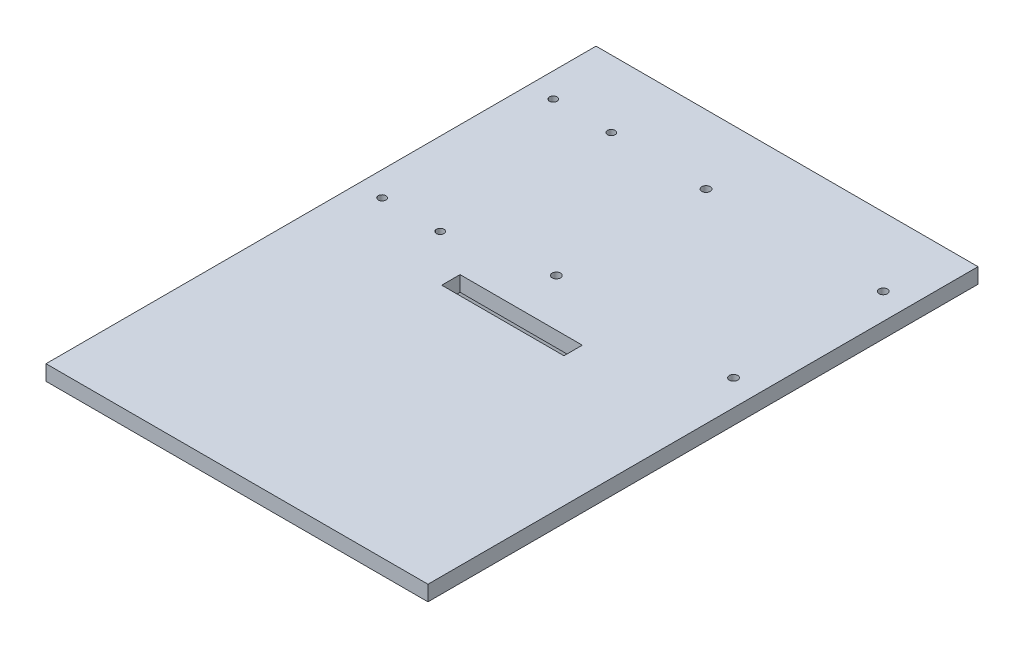
ISO-10303-21;
HEADER;
FILE_DESCRIPTION(('STEP AP214'),'2;1');
FILE_NAME('part.step','',(''),(''),'','','');
FILE_SCHEMA(('AUTOMOTIVE_DESIGN { 1 0 10303 214 1 1 1 1 }'));
ENDSEC;
DATA;
#1=APPLICATION_CONTEXT('core data for automotive mechanical design processes');
#2=APPLICATION_PROTOCOL_DEFINITION('international standard','automotive_design',2000,#1);
#3=PRODUCT_CONTEXT('',#1,'mechanical');
#4=PRODUCT('Part','Part','',(#3));
#5=PRODUCT_RELATED_PRODUCT_CATEGORY('part','',(#4));
#6=PRODUCT_DEFINITION_FORMATION('','',#4);
#7=PRODUCT_DEFINITION_CONTEXT('part definition',#1,'design');
#8=PRODUCT_DEFINITION('design','',#6,#7);
#9=PRODUCT_DEFINITION_SHAPE('','',#8);
#10=(LENGTH_UNIT() NAMED_UNIT(*) SI_UNIT(.MILLI.,.METRE.));
#11=(NAMED_UNIT(*) PLANE_ANGLE_UNIT() SI_UNIT($,.RADIAN.));
#12=(NAMED_UNIT(*) SI_UNIT($,.STERADIAN.) SOLID_ANGLE_UNIT());
#13=UNCERTAINTY_MEASURE_WITH_UNIT(LENGTH_MEASURE(1.E-05),#10,'distance_accuracy_value','');
#14=(GEOMETRIC_REPRESENTATION_CONTEXT(3) GLOBAL_UNCERTAINTY_ASSIGNED_CONTEXT((#13)) GLOBAL_UNIT_ASSIGNED_CONTEXT((#10,
#11,#12)) REPRESENTATION_CONTEXT('',''));
#15=CARTESIAN_POINT('',(0.,0.,0.));
#16=DIRECTION('',(0.,0.,1.));
#17=DIRECTION('',(1.,0.,0.));
#18=AXIS2_PLACEMENT_3D('',#15,#16,#17);
#19=CARTESIAN_POINT('',(0.,15.,0.));
#20=DIRECTION('',(0.,1.,0.));
#21=DIRECTION('',(0.,0.,1.));
#22=AXIS2_PLACEMENT_3D('',#19,#20,#21);
#23=PLANE('',#22);
#24=DIRECTION('',(-1.,0.,0.));
#25=VECTOR('',#24,1.);
#26=CARTESIAN_POINT('',(-29.,15.,-4.));
#27=LINE('',#26,#25);
#28=CARTESIAN_POINT('',(29.,15.,-4.));
#29=VERTEX_POINT('',#28);
#30=CARTESIAN_POINT('',(-29.,15.,-4.));
#31=VERTEX_POINT('',#30);
#32=EDGE_CURVE('E229',#29,#31,#27,.T.);
#33=ORIENTED_EDGE('',*,*,#32,.F.);
#34=DIRECTION('',(0.,0.,-1.));
#35=VECTOR('',#34,1.);
#36=CARTESIAN_POINT('',(29.,15.,-4.));
#37=LINE('',#36,#35);
#38=CARTESIAN_POINT('',(29.,15.,4.));
#39=VERTEX_POINT('',#38);
#40=EDGE_CURVE('E226',#39,#29,#37,.T.);
#41=ORIENTED_EDGE('',*,*,#40,.F.);
#42=DIRECTION('',(1.,0.,0.));
#43=VECTOR('',#42,1.);
#44=CARTESIAN_POINT('',(-29.,15.,4.));
#45=LINE('',#44,#43);
#46=CARTESIAN_POINT('',(-29.,15.,4.));
#47=VERTEX_POINT('',#46);
#48=EDGE_CURVE('E236',#47,#39,#45,.T.);
#49=ORIENTED_EDGE('',*,*,#48,.F.);
#50=DIRECTION('',(0.,0.,1.));
#51=VECTOR('',#50,1.);
#52=CARTESIAN_POINT('',(-29.,15.,-4.));
#53=LINE('',#52,#51);
#54=EDGE_CURVE('E233',#31,#47,#53,.T.);
#55=ORIENTED_EDGE('',*,*,#54,.F.);
#56=EDGE_LOOP('',(#33,#41,#49,#55));
#57=FACE_BOUND('',#56,.T.);
#58=DIRECTION('',(0.,0.,-1.));
#59=VECTOR('',#58,1.);
#60=CARTESIAN_POINT('',(-20.,15.,-3.));
#61=LINE('',#60,#59);
#62=CARTESIAN_POINT('',(-20.,15.,3.));
#63=VERTEX_POINT('',#62);
#64=CARTESIAN_POINT('',(-20.,15.,-3.));
#65=VERTEX_POINT('',#64);
#66=EDGE_CURVE('E163',#63,#65,#61,.T.);
#67=ORIENTED_EDGE('',*,*,#66,.F.);
#68=DIRECTION('',(-1.,0.,0.));
#69=VECTOR('',#68,1.);
#70=CARTESIAN_POINT('',(-20.,15.,3.));
#71=LINE('',#70,#69);
#72=CARTESIAN_POINT('',(20.,15.,3.));
#73=VERTEX_POINT('',#72);
#74=EDGE_CURVE('E165',#73,#63,#71,.T.);
#75=ORIENTED_EDGE('',*,*,#74,.F.);
#76=DIRECTION('',(0.,0.,1.));
#77=VECTOR('',#76,1.);
#78=CARTESIAN_POINT('',(20.,15.,-3.));
#79=LINE('',#78,#77);
#80=CARTESIAN_POINT('',(20.,15.,-3.));
#81=VERTEX_POINT('',#80);
#82=EDGE_CURVE('E50',#81,#73,#79,.T.);
#83=ORIENTED_EDGE('',*,*,#82,.F.);
#84=DIRECTION('',(1.,0.,0.));
#85=VECTOR('',#84,1.);
#86=CARTESIAN_POINT('',(-20.,15.,-3.));
#87=LINE('',#86,#85);
#88=EDGE_CURVE('E172',#65,#81,#87,.T.);
#89=ORIENTED_EDGE('',*,*,#88,.F.);
#90=EDGE_LOOP('',(#67,#75,#83,#89));
#91=FACE_BOUND('',#90,.T.);
#92=ADVANCED_FACE('F33',(#57,#91),#23,.F.);
#93=CARTESIAN_POINT('',(0.,0.,0.));
#94=DIRECTION('',(0.,1.,0.));
#95=DIRECTION('',(0.,0.,1.));
#96=AXIS2_PLACEMENT_3D('',#93,#94,#95);
#97=PLANE('',#96);
#98=DIRECTION('',(0.,0.,-1.));
#99=VECTOR('',#98,1.);
#100=CARTESIAN_POINT('',(31.,0.,-6.));
#101=LINE('',#100,#99);
#102=CARTESIAN_POINT('',(31.,0.,6.));
#103=VERTEX_POINT('',#102);
#104=CARTESIAN_POINT('',(31.,0.,-6.));
#105=VERTEX_POINT('',#104);
#106=EDGE_CURVE('E259',#103,#105,#101,.T.);
#107=ORIENTED_EDGE('',*,*,#106,.F.);
#108=DIRECTION('',(1.,0.,0.));
#109=VECTOR('',#108,1.);
#110=CARTESIAN_POINT('',(-31.,0.,6.));
#111=LINE('',#110,#109);
#112=CARTESIAN_POINT('',(-31.,0.,6.));
#113=VERTEX_POINT('',#112);
#114=EDGE_CURVE('E264',#113,#103,#111,.T.);
#115=ORIENTED_EDGE('',*,*,#114,.F.);
#116=DIRECTION('',(0.,0.,1.));
#117=VECTOR('',#116,1.);
#118=CARTESIAN_POINT('',(-31.,0.,-6.));
#119=LINE('',#118,#117);
#120=CARTESIAN_POINT('',(-31.,0.,-6.));
#121=VERTEX_POINT('',#120);
#122=EDGE_CURVE('E278',#121,#113,#119,.T.);
#123=ORIENTED_EDGE('',*,*,#122,.F.);
#124=DIRECTION('',(-1.,0.,0.));
#125=VECTOR('',#124,1.);
#126=CARTESIAN_POINT('',(-31.,0.,-6.));
#127=LINE('',#126,#125);
#128=EDGE_CURVE('E276',#105,#121,#127,.T.);
#129=ORIENTED_EDGE('',*,*,#128,.F.);
#130=EDGE_LOOP('',(#107,#115,#123,#129));
#131=FACE_BOUND('',#130,.T.);
#132=DIRECTION('',(0.,0.,-1.));
#133=VECTOR('',#132,1.);
#134=CARTESIAN_POINT('',(29.,0.,-4.));
#135=LINE('',#134,#133);
#136=CARTESIAN_POINT('',(29.,0.,4.));
#137=VERTEX_POINT('',#136);
#138=CARTESIAN_POINT('',(29.,0.,-4.));
#139=VERTEX_POINT('',#138);
#140=EDGE_CURVE('E225',#137,#139,#135,.T.);
#141=ORIENTED_EDGE('',*,*,#140,.T.);
#142=DIRECTION('',(-1.,0.,0.));
#143=VECTOR('',#142,1.);
#144=CARTESIAN_POINT('',(-29.,0.,-4.));
#145=LINE('',#144,#143);
#146=CARTESIAN_POINT('',(-29.,0.,-4.));
#147=VERTEX_POINT('',#146);
#148=EDGE_CURVE('E242',#139,#147,#145,.T.);
#149=ORIENTED_EDGE('',*,*,#148,.T.);
#150=DIRECTION('',(0.,0.,1.));
#151=VECTOR('',#150,1.);
#152=CARTESIAN_POINT('',(-29.,0.,-4.));
#153=LINE('',#152,#151);
#154=CARTESIAN_POINT('',(-29.,0.,4.));
#155=VERTEX_POINT('',#154);
#156=EDGE_CURVE('E245',#147,#155,#153,.T.);
#157=ORIENTED_EDGE('',*,*,#156,.T.);
#158=DIRECTION('',(1.,0.,0.));
#159=VECTOR('',#158,1.);
#160=CARTESIAN_POINT('',(-29.,0.,4.));
#161=LINE('',#160,#159);
#162=EDGE_CURVE('E230',#155,#137,#161,.T.);
#163=ORIENTED_EDGE('',*,*,#162,.T.);
#164=EDGE_LOOP('',(#141,#149,#157,#163));
#165=FACE_BOUND('',#164,.T.);
#166=ADVANCED_FACE('F342',(#131,#165),#97,.F.);
#167=CARTESIAN_POINT('',(31.,15.,-6.));
#168=DIRECTION('',(-1.,0.,0.));
#169=DIRECTION('',(0.,0.,1.));
#170=AXIS2_PLACEMENT_3D('',#167,#168,#169);
#171=PLANE('',#170);
#172=ORIENTED_EDGE('',*,*,#106,.T.);
#173=DIRECTION('',(0.,-1.,0.));
#174=VECTOR('',#173,1.);
#175=CARTESIAN_POINT('',(31.,15.,-6.));
#176=LINE('',#175,#174);
#177=CARTESIAN_POINT('',(31.,15.,-6.));
#178=VERTEX_POINT('',#177);
#179=EDGE_CURVE('E11',#178,#105,#176,.T.);
#180=ORIENTED_EDGE('',*,*,#179,.F.);
#181=DIRECTION('',(0.,0.,-1.));
#182=VECTOR('',#181,1.);
#183=CARTESIAN_POINT('',(31.,15.,-6.));
#184=LINE('',#183,#182);
#185=CARTESIAN_POINT('',(31.,15.,6.));
#186=VERTEX_POINT('',#185);
#187=EDGE_CURVE('E260',#186,#178,#184,.T.);
#188=ORIENTED_EDGE('',*,*,#187,.F.);
#189=DIRECTION('',(0.,-1.,0.));
#190=VECTOR('',#189,1.);
#191=CARTESIAN_POINT('',(31.,15.,6.));
#192=LINE('',#191,#190);
#193=EDGE_CURVE('E273',#186,#103,#192,.T.);
#194=ORIENTED_EDGE('',*,*,#193,.T.);
#195=EDGE_LOOP('',(#172,#180,#188,#194));
#196=FACE_BOUND('',#195,.T.);
#197=ADVANCED_FACE('F35',(#196),#171,.F.);
#198=CARTESIAN_POINT('',(-31.,15.,-6.));
#199=DIRECTION('',(0.,0.,1.));
#200=DIRECTION('',(1.,0.,0.));
#201=AXIS2_PLACEMENT_3D('',#198,#199,#200);
#202=PLANE('',#201);
#203=CARTESIAN_POINT('',(0.,9.,-6.));
#204=DIRECTION('',(0.,0.,1.));
#205=DIRECTION('',(1.,0.,0.));
#206=AXIS2_PLACEMENT_3D('',#203,#204,#205);
#207=CIRCLE('',#206,3.175);
#208=CARTESIAN_POINT('',(3.175,9.,-6.));
#209=VERTEX_POINT('',#208);
#210=EDGE_CURVE('E216',#209,#209,#207,.T.);
#211=ORIENTED_EDGE('',*,*,#210,.T.);
#212=EDGE_LOOP('',(#211));
#213=FACE_BOUND('',#212,.T.);
#214=ORIENTED_EDGE('',*,*,#128,.T.);
#215=DIRECTION('',(0.,-1.,0.));
#216=VECTOR('',#215,1.);
#217=CARTESIAN_POINT('',(-31.,15.,-6.));
#218=LINE('',#217,#216);
#219=CARTESIAN_POINT('',(-31.,15.,-6.));
#220=VERTEX_POINT('',#219);
#221=EDGE_CURVE('E42',#220,#121,#218,.T.);
#222=ORIENTED_EDGE('',*,*,#221,.F.);
#223=DIRECTION('',(-1.,0.,0.));
#224=VECTOR('',#223,1.);
#225=CARTESIAN_POINT('',(-31.,15.,-6.));
#226=LINE('',#225,#224);
#227=EDGE_CURVE('E263',#178,#220,#226,.T.);
#228=ORIENTED_EDGE('',*,*,#227,.F.);
#229=ORIENTED_EDGE('',*,*,#179,.T.);
#230=EDGE_LOOP('',(#214,#222,#228,#229));
#231=FACE_BOUND('',#230,.T.);
#232=ADVANCED_FACE('F397',(#213,#231),#202,.F.);
#233=CARTESIAN_POINT('',(-31.,15.,-6.));
#234=DIRECTION('',(1.,0.,0.));
#235=DIRECTION('',(0.,0.,-1.));
#236=AXIS2_PLACEMENT_3D('',#233,#234,#235);
#237=PLANE('',#236);
#238=ORIENTED_EDGE('',*,*,#122,.T.);
#239=DIRECTION('',(0.,-1.,0.));
#240=VECTOR('',#239,1.);
#241=CARTESIAN_POINT('',(-31.,15.,6.));
#242=LINE('',#241,#240);
#243=CARTESIAN_POINT('',(-31.,15.,6.));
#244=VERTEX_POINT('',#243);
#245=EDGE_CURVE('E283',#244,#113,#242,.T.);
#246=ORIENTED_EDGE('',*,*,#245,.F.);
#247=DIRECTION('',(0.,0.,1.));
#248=VECTOR('',#247,1.);
#249=CARTESIAN_POINT('',(-31.,15.,-6.));
#250=LINE('',#249,#248);
#251=EDGE_CURVE('E267',#220,#244,#250,.T.);
#252=ORIENTED_EDGE('',*,*,#251,.F.);
#253=ORIENTED_EDGE('',*,*,#221,.T.);
#254=EDGE_LOOP('',(#238,#246,#252,#253));
#255=FACE_BOUND('',#254,.T.);
#256=ADVANCED_FACE('F399',(#255),#237,.F.);
#257=CARTESIAN_POINT('',(-31.,15.,6.));
#258=DIRECTION('',(0.,0.,-1.));
#259=DIRECTION('',(-1.,0.,0.));
#260=AXIS2_PLACEMENT_3D('',#257,#258,#259);
#261=PLANE('',#260);
#262=CARTESIAN_POINT('',(0.,9.,6.));
#263=DIRECTION('',(0.,0.,1.));
#264=DIRECTION('',(1.,0.,0.));
#265=AXIS2_PLACEMENT_3D('',#262,#263,#264);
#266=CIRCLE('',#265,3.175);
#267=CARTESIAN_POINT('',(3.175,9.,6.));
#268=VERTEX_POINT('',#267);
#269=EDGE_CURVE('E215',#268,#268,#266,.T.);
#270=ORIENTED_EDGE('',*,*,#269,.F.);
#271=EDGE_LOOP('',(#270));
#272=FACE_BOUND('',#271,.T.);
#273=ORIENTED_EDGE('',*,*,#114,.T.);
#274=ORIENTED_EDGE('',*,*,#193,.F.);
#275=DIRECTION('',(1.,0.,0.));
#276=VECTOR('',#275,1.);
#277=CARTESIAN_POINT('',(-31.,15.,6.));
#278=LINE('',#277,#276);
#279=EDGE_CURVE('E270',#244,#186,#278,.T.);
#280=ORIENTED_EDGE('',*,*,#279,.F.);
#281=ORIENTED_EDGE('',*,*,#245,.T.);
#282=EDGE_LOOP('',(#273,#274,#280,#281));
#283=FACE_BOUND('',#282,.T.);
#284=ADVANCED_FACE('F389',(#272,#283),#261,.F.);
#285=CARTESIAN_POINT('',(29.,15.,-4.));
#286=DIRECTION('',(-1.,0.,0.));
#287=DIRECTION('',(0.,0.,1.));
#288=AXIS2_PLACEMENT_3D('',#285,#286,#287);
#289=PLANE('',#288);
#290=ORIENTED_EDGE('',*,*,#140,.F.);
#291=DIRECTION('',(0.,-1.,0.));
#292=VECTOR('',#291,1.);
#293=CARTESIAN_POINT('',(29.,15.,4.));
#294=LINE('',#293,#292);
#295=EDGE_CURVE('E239',#39,#137,#294,.T.);
#296=ORIENTED_EDGE('',*,*,#295,.F.);
#297=ORIENTED_EDGE('',*,*,#40,.T.);
#298=DIRECTION('',(0.,-1.,0.));
#299=VECTOR('',#298,1.);
#300=CARTESIAN_POINT('',(29.,15.,-4.));
#301=LINE('',#300,#299);
#302=EDGE_CURVE('E256',#29,#139,#301,.T.);
#303=ORIENTED_EDGE('',*,*,#302,.T.);
#304=EDGE_LOOP('',(#290,#296,#297,#303));
#305=FACE_BOUND('',#304,.T.);
#306=ADVANCED_FACE('F406',(#305),#289,.T.);
#307=CARTESIAN_POINT('',(-29.,15.,-4.));
#308=DIRECTION('',(0.,0.,1.));
#309=DIRECTION('',(1.,0.,0.));
#310=AXIS2_PLACEMENT_3D('',#307,#308,#309);
#311=PLANE('',#310);
#312=CARTESIAN_POINT('',(0.,9.,-4.));
#313=DIRECTION('',(0.,0.,1.));
#314=DIRECTION('',(1.,0.,0.));
#315=AXIS2_PLACEMENT_3D('',#312,#313,#314);
#316=CIRCLE('',#315,3.175);
#317=CARTESIAN_POINT('',(3.175,9.,-4.));
#318=VERTEX_POINT('',#317);
#319=EDGE_CURVE('E222',#318,#318,#316,.T.);
#320=ORIENTED_EDGE('',*,*,#319,.F.);
#321=EDGE_LOOP('',(#320));
#322=FACE_BOUND('',#321,.T.);
#323=ORIENTED_EDGE('',*,*,#148,.F.);
#324=ORIENTED_EDGE('',*,*,#302,.F.);
#325=ORIENTED_EDGE('',*,*,#32,.T.);
#326=DIRECTION('',(0.,-1.,0.));
#327=VECTOR('',#326,1.);
#328=CARTESIAN_POINT('',(-29.,15.,-4.));
#329=LINE('',#328,#327);
#330=EDGE_CURVE('E254',#31,#147,#329,.T.);
#331=ORIENTED_EDGE('',*,*,#330,.T.);
#332=EDGE_LOOP('',(#323,#324,#325,#331));
#333=FACE_BOUND('',#332,.T.);
#334=ADVANCED_FACE('F413',(#322,#333),#311,.T.);
#335=CARTESIAN_POINT('',(-29.,15.,-4.));
#336=DIRECTION('',(1.,0.,0.));
#337=DIRECTION('',(0.,0.,-1.));
#338=AXIS2_PLACEMENT_3D('',#335,#336,#337);
#339=PLANE('',#338);
#340=ORIENTED_EDGE('',*,*,#156,.F.);
#341=ORIENTED_EDGE('',*,*,#330,.F.);
#342=ORIENTED_EDGE('',*,*,#54,.T.);
#343=DIRECTION('',(0.,-1.,0.));
#344=VECTOR('',#343,1.);
#345=CARTESIAN_POINT('',(-29.,15.,4.));
#346=LINE('',#345,#344);
#347=EDGE_CURVE('E252',#47,#155,#346,.T.);
#348=ORIENTED_EDGE('',*,*,#347,.T.);
#349=EDGE_LOOP('',(#340,#341,#342,#348));
#350=FACE_BOUND('',#349,.T.);
#351=ADVANCED_FACE('F417',(#350),#339,.T.);
#352=CARTESIAN_POINT('',(-29.,15.,4.));
#353=DIRECTION('',(0.,0.,-1.));
#354=DIRECTION('',(-1.,0.,0.));
#355=AXIS2_PLACEMENT_3D('',#352,#353,#354);
#356=PLANE('',#355);
#357=CARTESIAN_POINT('',(0.,9.,4.));
#358=DIRECTION('',(0.,0.,-1.));
#359=DIRECTION('',(-1.,0.,0.));
#360=AXIS2_PLACEMENT_3D('',#357,#358,#359);
#361=CIRCLE('',#360,3.175);
#362=CARTESIAN_POINT('',(-3.175,9.,4.));
#363=VERTEX_POINT('',#362);
#364=EDGE_CURVE('E219',#363,#363,#361,.T.);
#365=ORIENTED_EDGE('',*,*,#364,.F.);
#366=EDGE_LOOP('',(#365));
#367=FACE_BOUND('',#366,.T.);
#368=ORIENTED_EDGE('',*,*,#162,.F.);
#369=ORIENTED_EDGE('',*,*,#347,.F.);
#370=ORIENTED_EDGE('',*,*,#48,.T.);
#371=ORIENTED_EDGE('',*,*,#295,.T.);
#372=EDGE_LOOP('',(#368,#369,#370,#371));
#373=FACE_BOUND('',#372,.T.);
#374=ADVANCED_FACE('F421',(#367,#373),#356,.T.);
#375=CARTESIAN_POINT('',(0.,9.,-6.));
#376=DIRECTION('',(0.,0.,1.));
#377=DIRECTION('',(1.,0.,0.));
#378=AXIS2_PLACEMENT_3D('',#375,#376,#377);
#379=CYLINDRICAL_SURFACE('',#378,3.175);
#380=ORIENTED_EDGE('',*,*,#364,.T.);
#381=EDGE_LOOP('',(#380));
#382=FACE_BOUND('',#381,.T.);
#383=ORIENTED_EDGE('',*,*,#269,.T.);
#384=EDGE_LOOP('',(#383));
#385=FACE_BOUND('',#384,.T.);
#386=ADVANCED_FACE('F364',(#382,#385),#379,.F.);
#387=ORIENTED_EDGE('',*,*,#319,.T.);
#388=EDGE_LOOP('',(#387));
#389=FACE_BOUND('',#388,.T.);
#390=ORIENTED_EDGE('',*,*,#210,.F.);
#391=EDGE_LOOP('',(#390));
#392=FACE_BOUND('',#391,.T.);
#393=ADVANCED_FACE('F355',(#389,#392),#379,.F.);
#394=CARTESIAN_POINT('',(-54.5,15.,-68.));
#395=DIRECTION('',(0.,1.,0.));
#396=DIRECTION('',(0.,0.,1.));
#397=AXIS2_PLACEMENT_3D('',#394,#395,#396);
#398=CIRCLE('',#397,1.25);
#399=CARTESIAN_POINT('',(-54.5,15.,-66.75));
#400=VERTEX_POINT('',#399);
#401=EDGE_CURVE('E294',#400,#400,#398,.T.);
#402=ORIENTED_EDGE('',*,*,#401,.T.);
#403=EDGE_LOOP('',(#402));
#404=FACE_BOUND('',#403,.T.);
#405=CARTESIAN_POINT('',(-35.5,15.,-12.));
#406=DIRECTION('',(0.,1.,0.));
#407=DIRECTION('',(0.,0.,1.));
#408=AXIS2_PLACEMENT_3D('',#405,#406,#407);
#409=CIRCLE('',#408,1.25);
#410=CARTESIAN_POINT('',(-35.5,15.,-10.75));
#411=VERTEX_POINT('',#410);
#412=EDGE_CURVE('E316',#411,#411,#409,.T.);
#413=ORIENTED_EDGE('',*,*,#412,.T.);
#414=EDGE_LOOP('',(#413));
#415=FACE_BOUND('',#414,.T.);
#416=CARTESIAN_POINT('',(-54.5,15.,-12.));
#417=DIRECTION('',(0.,1.,0.));
#418=DIRECTION('',(0.,0.,1.));
#419=AXIS2_PLACEMENT_3D('',#416,#417,#418);
#420=CIRCLE('',#419,1.25);
#421=CARTESIAN_POINT('',(-54.5,15.,-10.75));
#422=VERTEX_POINT('',#421);
#423=EDGE_CURVE('E313',#422,#422,#420,.T.);
#424=ORIENTED_EDGE('',*,*,#423,.T.);
#425=EDGE_LOOP('',(#424));
#426=FACE_BOUND('',#425,.T.);
#427=CARTESIAN_POINT('',(-35.5,15.,-68.));
#428=DIRECTION('',(0.,1.,0.));
#429=DIRECTION('',(0.,0.,1.));
#430=AXIS2_PLACEMENT_3D('',#427,#428,#429);
#431=CIRCLE('',#430,1.25);
#432=CARTESIAN_POINT('',(-35.5,15.,-66.75));
#433=VERTEX_POINT('',#432);
#434=EDGE_CURVE('E310',#433,#433,#431,.T.);
#435=ORIENTED_EDGE('',*,*,#434,.T.);
#436=EDGE_LOOP('',(#435));
#437=FACE_BOUND('',#436,.T.);
#438=CARTESIAN_POINT('',(54.,15.,-18.5));
#439=DIRECTION('',(0.,1.,0.));
#440=DIRECTION('',(0.,0.,1.));
#441=AXIS2_PLACEMENT_3D('',#438,#439,#440);
#442=CIRCLE('',#441,1.375);
#443=CARTESIAN_POINT('',(54.,15.,-17.125));
#444=VERTEX_POINT('',#443);
#445=EDGE_CURVE('E306',#444,#444,#442,.T.);
#446=ORIENTED_EDGE('',*,*,#445,.T.);
#447=EDGE_LOOP('',(#446));
#448=FACE_BOUND('',#447,.T.);
#449=CARTESIAN_POINT('',(-3.99999999999998,15.,-67.5));
#450=DIRECTION('',(0.,1.,0.));
#451=DIRECTION('',(0.,0.,1.));
#452=AXIS2_PLACEMENT_3D('',#449,#450,#451);
#453=CIRCLE('',#452,1.375);
#454=CARTESIAN_POINT('',(-3.99999999999998,15.,-66.125));
#455=VERTEX_POINT('',#454);
#456=EDGE_CURVE('E302',#455,#455,#453,.T.);
#457=ORIENTED_EDGE('',*,*,#456,.T.);
#458=EDGE_LOOP('',(#457));
#459=FACE_BOUND('',#458,.T.);
#460=CARTESIAN_POINT('',(-3.99999999999998,15.,-18.5));
#461=DIRECTION('',(0.,1.,0.));
#462=DIRECTION('',(0.,0.,1.));
#463=AXIS2_PLACEMENT_3D('',#460,#461,#462);
#464=CIRCLE('',#463,1.375);
#465=CARTESIAN_POINT('',(-3.99999999999998,15.,-17.125));
#466=VERTEX_POINT('',#465);
#467=EDGE_CURVE('E298',#466,#466,#464,.T.);
#468=ORIENTED_EDGE('',*,*,#467,.T.);
#469=EDGE_LOOP('',(#468));
#470=FACE_BOUND('',#469,.T.);
#471=CARTESIAN_POINT('',(54.,15.,-67.5));
#472=DIRECTION('',(0.,1.,0.));
#473=DIRECTION('',(0.,0.,1.));
#474=AXIS2_PLACEMENT_3D('',#471,#472,#473);
#475=CIRCLE('',#474,1.375);
#476=CARTESIAN_POINT('',(54.,15.,-66.125));
#477=VERTEX_POINT('',#476);
#478=EDGE_CURVE('E293',#477,#477,#475,.T.);
#479=ORIENTED_EDGE('',*,*,#478,.T.);
#480=EDGE_LOOP('',(#479));
#481=FACE_BOUND('',#480,.T.);
#482=DIRECTION('',(0.,0.,-1.));
#483=VECTOR('',#482,1.);
#484=CARTESIAN_POINT('',(62.5,15.,-90.));
#485=LINE('',#484,#483);
#486=CARTESIAN_POINT('',(62.5,15.,90.));
#487=VERTEX_POINT('',#486);
#488=CARTESIAN_POINT('',(62.5,15.,-90.));
#489=VERTEX_POINT('',#488);
#490=EDGE_CURVE('E155',#487,#489,#485,.T.);
#491=ORIENTED_EDGE('',*,*,#490,.F.);
#492=DIRECTION('',(1.,0.,0.));
#493=VECTOR('',#492,1.);
#494=CARTESIAN_POINT('',(-62.5,15.,90.));
#495=LINE('',#494,#493);
#496=CARTESIAN_POINT('',(-62.5,15.,90.));
#497=VERTEX_POINT('',#496);
#498=EDGE_CURVE('E190',#497,#487,#495,.T.);
#499=ORIENTED_EDGE('',*,*,#498,.F.);
#500=DIRECTION('',(0.,0.,1.));
#501=VECTOR('',#500,1.);
#502=CARTESIAN_POINT('',(-62.5,15.,-90.));
#503=LINE('',#502,#501);
#504=CARTESIAN_POINT('',(-62.5,15.,-90.));
#505=VERTEX_POINT('',#504);
#506=EDGE_CURVE('E201',#505,#497,#503,.T.);
#507=ORIENTED_EDGE('',*,*,#506,.F.);
#508=DIRECTION('',(-1.,0.,0.));
#509=VECTOR('',#508,1.);
#510=CARTESIAN_POINT('',(-62.5,15.,-90.));
#511=LINE('',#510,#509);
#512=EDGE_CURVE('E199',#489,#505,#511,.T.);
#513=ORIENTED_EDGE('',*,*,#512,.F.);
#514=EDGE_LOOP('',(#491,#499,#507,#513));
#515=FACE_BOUND('',#514,.T.);
#516=ORIENTED_EDGE('',*,*,#279,.T.);
#517=ORIENTED_EDGE('',*,*,#187,.T.);
#518=ORIENTED_EDGE('',*,*,#227,.T.);
#519=ORIENTED_EDGE('',*,*,#251,.T.);
#520=EDGE_LOOP('',(#516,#517,#518,#519));
#521=FACE_BOUND('',#520,.T.);
#522=ADVANCED_FACE('F345',(#404,#415,#426,#437,#448,#459,#470,#481,#515,#521),#23,.F.);
#523=CARTESIAN_POINT('',(62.5,20.,-90.));
#524=DIRECTION('',(-1.,0.,0.));
#525=DIRECTION('',(0.,0.,1.));
#526=AXIS2_PLACEMENT_3D('',#523,#524,#525);
#527=PLANE('',#526);
#528=ORIENTED_EDGE('',*,*,#490,.T.);
#529=DIRECTION('',(0.,-1.,0.));
#530=VECTOR('',#529,1.);
#531=CARTESIAN_POINT('',(62.5,20.,-90.));
#532=LINE('',#531,#530);
#533=CARTESIAN_POINT('',(62.5,20.,-90.));
#534=VERTEX_POINT('',#533);
#535=EDGE_CURVE('E212',#534,#489,#532,.T.);
#536=ORIENTED_EDGE('',*,*,#535,.F.);
#537=DIRECTION('',(0.,0.,-1.));
#538=VECTOR('',#537,1.);
#539=CARTESIAN_POINT('',(62.5,20.,-90.));
#540=LINE('',#539,#538);
#541=CARTESIAN_POINT('',(62.5,20.,90.));
#542=VERTEX_POINT('',#541);
#543=EDGE_CURVE('E186',#542,#534,#540,.T.);
#544=ORIENTED_EDGE('',*,*,#543,.F.);
#545=DIRECTION('',(0.,-1.,0.));
#546=VECTOR('',#545,1.);
#547=CARTESIAN_POINT('',(62.5,20.,90.));
#548=LINE('',#547,#546);
#549=EDGE_CURVE('E196',#542,#487,#548,.T.);
#550=ORIENTED_EDGE('',*,*,#549,.T.);
#551=EDGE_LOOP('',(#528,#536,#544,#550));
#552=FACE_BOUND('',#551,.T.);
#553=ADVANCED_FACE('F354',(#552),#527,.F.);
#554=CARTESIAN_POINT('',(-62.5,20.,-90.));
#555=DIRECTION('',(0.,0.,1.));
#556=DIRECTION('',(1.,0.,0.));
#557=AXIS2_PLACEMENT_3D('',#554,#555,#556);
#558=PLANE('',#557);
#559=ORIENTED_EDGE('',*,*,#512,.T.);
#560=DIRECTION('',(0.,-1.,0.));
#561=VECTOR('',#560,1.);
#562=CARTESIAN_POINT('',(-62.5,20.,-90.));
#563=LINE('',#562,#561);
#564=CARTESIAN_POINT('',(-62.5,20.,-90.));
#565=VERTEX_POINT('',#564);
#566=EDGE_CURVE('E209',#565,#505,#563,.T.);
#567=ORIENTED_EDGE('',*,*,#566,.F.);
#568=DIRECTION('',(-1.,0.,0.));
#569=VECTOR('',#568,1.);
#570=CARTESIAN_POINT('',(-62.5,20.,-90.));
#571=LINE('',#570,#569);
#572=EDGE_CURVE('E189',#534,#565,#571,.T.);
#573=ORIENTED_EDGE('',*,*,#572,.F.);
#574=ORIENTED_EDGE('',*,*,#535,.T.);
#575=EDGE_LOOP('',(#559,#567,#573,#574));
#576=FACE_BOUND('',#575,.T.);
#577=ADVANCED_FACE('F361',(#576),#558,.F.);
#578=CARTESIAN_POINT('',(-62.5,20.,-90.));
#579=DIRECTION('',(1.,0.,0.));
#580=DIRECTION('',(0.,0.,-1.));
#581=AXIS2_PLACEMENT_3D('',#578,#579,#580);
#582=PLANE('',#581);
#583=ORIENTED_EDGE('',*,*,#506,.T.);
#584=DIRECTION('',(0.,-1.,0.));
#585=VECTOR('',#584,1.);
#586=CARTESIAN_POINT('',(-62.5,20.,90.));
#587=LINE('',#586,#585);
#588=CARTESIAN_POINT('',(-62.5,20.,90.));
#589=VERTEX_POINT('',#588);
#590=EDGE_CURVE('E206',#589,#497,#587,.T.);
#591=ORIENTED_EDGE('',*,*,#590,.F.);
#592=DIRECTION('',(0.,0.,1.));
#593=VECTOR('',#592,1.);
#594=CARTESIAN_POINT('',(-62.5,20.,-90.));
#595=LINE('',#594,#593);
#596=EDGE_CURVE('E192',#565,#589,#595,.T.);
#597=ORIENTED_EDGE('',*,*,#596,.F.);
#598=ORIENTED_EDGE('',*,*,#566,.T.);
#599=EDGE_LOOP('',(#583,#591,#597,#598));
#600=FACE_BOUND('',#599,.T.);
#601=ADVANCED_FACE('F430',(#600),#582,.F.);
#602=CARTESIAN_POINT('',(-62.5,20.,90.));
#603=DIRECTION('',(0.,0.,-1.));
#604=DIRECTION('',(-1.,0.,0.));
#605=AXIS2_PLACEMENT_3D('',#602,#603,#604);
#606=PLANE('',#605);
#607=ORIENTED_EDGE('',*,*,#498,.T.);
#608=ORIENTED_EDGE('',*,*,#549,.F.);
#609=DIRECTION('',(1.,0.,0.));
#610=VECTOR('',#609,1.);
#611=CARTESIAN_POINT('',(-62.5,20.,90.));
#612=LINE('',#611,#610);
#613=EDGE_CURVE('E194',#589,#542,#612,.T.);
#614=ORIENTED_EDGE('',*,*,#613,.F.);
#615=ORIENTED_EDGE('',*,*,#590,.T.);
#616=EDGE_LOOP('',(#607,#608,#614,#615));
#617=FACE_BOUND('',#616,.T.);
#618=ADVANCED_FACE('F433',(#617),#606,.F.);
#619=CARTESIAN_POINT('',(0.,20.,0.));
#620=DIRECTION('',(0.,1.,0.));
#621=DIRECTION('',(0.,0.,1.));
#622=AXIS2_PLACEMENT_3D('',#619,#620,#621);
#623=PLANE('',#622);
#624=CARTESIAN_POINT('',(-54.5,20.,-68.));
#625=DIRECTION('',(0.,1.,0.));
#626=DIRECTION('',(0.,0.,1.));
#627=AXIS2_PLACEMENT_3D('',#624,#625,#626);
#628=CIRCLE('',#627,1.25);
#629=CARTESIAN_POINT('',(-54.5,20.,-66.75));
#630=VERTEX_POINT('',#629);
#631=EDGE_CURVE('E37',#630,#630,#628,.T.);
#632=ORIENTED_EDGE('',*,*,#631,.F.);
#633=EDGE_LOOP('',(#632));
#634=FACE_BOUND('',#633,.T.);
#635=CARTESIAN_POINT('',(-35.5,20.,-12.));
#636=DIRECTION('',(0.,1.,0.));
#637=DIRECTION('',(0.,0.,1.));
#638=AXIS2_PLACEMENT_3D('',#635,#636,#637);
#639=CIRCLE('',#638,1.25);
#640=CARTESIAN_POINT('',(-35.5,20.,-10.75));
#641=VERTEX_POINT('',#640);
#642=EDGE_CURVE('E314',#641,#641,#639,.T.);
#643=ORIENTED_EDGE('',*,*,#642,.F.);
#644=EDGE_LOOP('',(#643));
#645=FACE_BOUND('',#644,.T.);
#646=CARTESIAN_POINT('',(-54.5,20.,-12.));
#647=DIRECTION('',(0.,1.,0.));
#648=DIRECTION('',(0.,0.,1.));
#649=AXIS2_PLACEMENT_3D('',#646,#647,#648);
#650=CIRCLE('',#649,1.25);
#651=CARTESIAN_POINT('',(-54.5,20.,-10.75));
#652=VERTEX_POINT('',#651);
#653=EDGE_CURVE('E311',#652,#652,#650,.T.);
#654=ORIENTED_EDGE('',*,*,#653,.F.);
#655=EDGE_LOOP('',(#654));
#656=FACE_BOUND('',#655,.T.);
#657=CARTESIAN_POINT('',(-35.5,20.,-68.));
#658=DIRECTION('',(0.,1.,0.));
#659=DIRECTION('',(0.,0.,1.));
#660=AXIS2_PLACEMENT_3D('',#657,#658,#659);
#661=CIRCLE('',#660,1.25);
#662=CARTESIAN_POINT('',(-35.5,20.,-66.75));
#663=VERTEX_POINT('',#662);
#664=EDGE_CURVE('E307',#663,#663,#661,.T.);
#665=ORIENTED_EDGE('',*,*,#664,.F.);
#666=EDGE_LOOP('',(#665));
#667=FACE_BOUND('',#666,.T.);
#668=CARTESIAN_POINT('',(54.,20.,-18.5));
#669=DIRECTION('',(0.,1.,0.));
#670=DIRECTION('',(0.,0.,1.));
#671=AXIS2_PLACEMENT_3D('',#668,#669,#670);
#672=CIRCLE('',#671,1.375);
#673=CARTESIAN_POINT('',(54.,20.,-17.125));
#674=VERTEX_POINT('',#673);
#675=EDGE_CURVE('E303',#674,#674,#672,.T.);
#676=ORIENTED_EDGE('',*,*,#675,.F.);
#677=EDGE_LOOP('',(#676));
#678=FACE_BOUND('',#677,.T.);
#679=CARTESIAN_POINT('',(-3.99999999999998,20.,-67.5));
#680=DIRECTION('',(0.,1.,0.));
#681=DIRECTION('',(0.,0.,1.));
#682=AXIS2_PLACEMENT_3D('',#679,#680,#681);
#683=CIRCLE('',#682,1.375);
#684=CARTESIAN_POINT('',(-3.99999999999998,20.,-66.125));
#685=VERTEX_POINT('',#684);
#686=EDGE_CURVE('E299',#685,#685,#683,.T.);
#687=ORIENTED_EDGE('',*,*,#686,.F.);
#688=EDGE_LOOP('',(#687));
#689=FACE_BOUND('',#688,.T.);
#690=CARTESIAN_POINT('',(-3.99999999999998,20.,-18.5));
#691=DIRECTION('',(0.,1.,0.));
#692=DIRECTION('',(0.,0.,1.));
#693=AXIS2_PLACEMENT_3D('',#690,#691,#692);
#694=CIRCLE('',#693,1.375);
#695=CARTESIAN_POINT('',(-3.99999999999998,20.,-17.125));
#696=VERTEX_POINT('',#695);
#697=EDGE_CURVE('E295',#696,#696,#694,.T.);
#698=ORIENTED_EDGE('',*,*,#697,.F.);
#699=EDGE_LOOP('',(#698));
#700=FACE_BOUND('',#699,.T.);
#701=CARTESIAN_POINT('',(54.,20.,-67.5));
#702=DIRECTION('',(0.,1.,0.));
#703=DIRECTION('',(0.,0.,1.));
#704=AXIS2_PLACEMENT_3D('',#701,#702,#703);
#705=CIRCLE('',#704,1.375);
#706=CARTESIAN_POINT('',(54.,20.,-66.125));
#707=VERTEX_POINT('',#706);
#708=EDGE_CURVE('E290',#707,#707,#705,.T.);
#709=ORIENTED_EDGE('',*,*,#708,.F.);
#710=EDGE_LOOP('',(#709));
#711=FACE_BOUND('',#710,.T.);
#712=DIRECTION('',(0.,0.,-1.));
#713=VECTOR('',#712,1.);
#714=CARTESIAN_POINT('',(-20.,20.,-3.));
#715=LINE('',#714,#713);
#716=CARTESIAN_POINT('',(-20.,20.,3.));
#717=VERTEX_POINT('',#716);
#718=CARTESIAN_POINT('',(-20.,20.,-3.));
#719=VERTEX_POINT('',#718);
#720=EDGE_CURVE('E160',#717,#719,#715,.T.);
#721=ORIENTED_EDGE('',*,*,#720,.T.);
#722=DIRECTION('',(1.,0.,0.));
#723=VECTOR('',#722,1.);
#724=CARTESIAN_POINT('',(-20.,20.,-3.));
#725=LINE('',#724,#723);
#726=CARTESIAN_POINT('',(20.,20.,-3.));
#727=VERTEX_POINT('',#726);
#728=EDGE_CURVE('E147',#719,#727,#725,.T.);
#729=ORIENTED_EDGE('',*,*,#728,.T.);
#730=DIRECTION('',(0.,0.,1.));
#731=VECTOR('',#730,1.);
#732=CARTESIAN_POINT('',(20.,20.,-3.));
#733=LINE('',#732,#731);
#734=CARTESIAN_POINT('',(20.,20.,3.));
#735=VERTEX_POINT('',#734);
#736=EDGE_CURVE('E174',#727,#735,#733,.T.);
#737=ORIENTED_EDGE('',*,*,#736,.T.);
#738=DIRECTION('',(-1.,0.,0.));
#739=VECTOR('',#738,1.);
#740=CARTESIAN_POINT('',(-20.,20.,3.));
#741=LINE('',#740,#739);
#742=EDGE_CURVE('E170',#735,#717,#741,.T.);
#743=ORIENTED_EDGE('',*,*,#742,.T.);
#744=EDGE_LOOP('',(#721,#729,#737,#743));
#745=FACE_BOUND('',#744,.T.);
#746=ORIENTED_EDGE('',*,*,#543,.T.);
#747=ORIENTED_EDGE('',*,*,#572,.T.);
#748=ORIENTED_EDGE('',*,*,#596,.T.);
#749=ORIENTED_EDGE('',*,*,#613,.T.);
#750=EDGE_LOOP('',(#746,#747,#748,#749));
#751=FACE_BOUND('',#750,.T.);
#752=ADVANCED_FACE('F168',(#634,#645,#656,#667,#678,#689,#700,#711,#745,#751),#623,.T.);
#753=CARTESIAN_POINT('',(-20.,20.001,-3.));
#754=DIRECTION('',(-1.,0.,0.));
#755=DIRECTION('',(0.,0.,1.));
#756=AXIS2_PLACEMENT_3D('',#753,#754,#755);
#757=PLANE('',#756);
#758=DIRECTION('',(0.,-1.,0.));
#759=VECTOR('',#758,1.);
#760=CARTESIAN_POINT('',(-20.,20.001,3.));
#761=LINE('',#760,#759);
#762=EDGE_CURVE('E156',#717,#63,#761,.T.);
#763=ORIENTED_EDGE('',*,*,#762,.T.);
#764=ORIENTED_EDGE('',*,*,#66,.T.);
#765=DIRECTION('',(0.,-1.,0.));
#766=VECTOR('',#765,1.);
#767=CARTESIAN_POINT('',(-20.,20.001,-3.));
#768=LINE('',#767,#766);
#769=EDGE_CURVE('E150',#719,#65,#768,.T.);
#770=ORIENTED_EDGE('',*,*,#769,.F.);
#771=ORIENTED_EDGE('',*,*,#720,.F.);
#772=EDGE_LOOP('',(#763,#764,#770,#771));
#773=FACE_BOUND('',#772,.T.);
#774=ADVANCED_FACE('F159',(#773),#757,.F.);
#775=CARTESIAN_POINT('',(-20.,20.001,3.));
#776=DIRECTION('',(0.,0.,1.));
#777=DIRECTION('',(1.,0.,0.));
#778=AXIS2_PLACEMENT_3D('',#775,#776,#777);
#779=PLANE('',#778);
#780=DIRECTION('',(0.,-1.,0.));
#781=VECTOR('',#780,1.);
#782=CARTESIAN_POINT('',(20.,20.001,3.));
#783=LINE('',#782,#781);
#784=EDGE_CURVE('E183',#735,#73,#783,.T.);
#785=ORIENTED_EDGE('',*,*,#784,.T.);
#786=ORIENTED_EDGE('',*,*,#74,.T.);
#787=ORIENTED_EDGE('',*,*,#762,.F.);
#788=ORIENTED_EDGE('',*,*,#742,.F.);
#789=EDGE_LOOP('',(#785,#786,#787,#788));
#790=FACE_BOUND('',#789,.T.);
#791=ADVANCED_FACE('F339',(#790),#779,.F.);
#792=CARTESIAN_POINT('',(20.,20.001,-3.));
#793=DIRECTION('',(1.,0.,0.));
#794=DIRECTION('',(0.,0.,-1.));
#795=AXIS2_PLACEMENT_3D('',#792,#793,#794);
#796=PLANE('',#795);
#797=DIRECTION('',(0.,-1.,0.));
#798=VECTOR('',#797,1.);
#799=CARTESIAN_POINT('',(20.,20.001,-3.));
#800=LINE('',#799,#798);
#801=EDGE_CURVE('E57',#727,#81,#800,.T.);
#802=ORIENTED_EDGE('',*,*,#801,.T.);
#803=ORIENTED_EDGE('',*,*,#82,.T.);
#804=ORIENTED_EDGE('',*,*,#784,.F.);
#805=ORIENTED_EDGE('',*,*,#736,.F.);
#806=EDGE_LOOP('',(#802,#803,#804,#805));
#807=FACE_BOUND('',#806,.T.);
#808=ADVANCED_FACE('F336',(#807),#796,.F.);
#809=CARTESIAN_POINT('',(-20.,20.001,-3.));
#810=DIRECTION('',(0.,0.,-1.));
#811=DIRECTION('',(-1.,0.,0.));
#812=AXIS2_PLACEMENT_3D('',#809,#810,#811);
#813=PLANE('',#812);
#814=ORIENTED_EDGE('',*,*,#769,.T.);
#815=ORIENTED_EDGE('',*,*,#88,.T.);
#816=ORIENTED_EDGE('',*,*,#801,.F.);
#817=ORIENTED_EDGE('',*,*,#728,.F.);
#818=EDGE_LOOP('',(#814,#815,#816,#817));
#819=FACE_BOUND('',#818,.T.);
#820=ADVANCED_FACE('F149',(#819),#813,.F.);
#821=CARTESIAN_POINT('',(54.,0.,-67.5));
#822=DIRECTION('',(0.,1.,0.));
#823=DIRECTION('',(0.,0.,1.));
#824=AXIS2_PLACEMENT_3D('',#821,#822,#823);
#825=CYLINDRICAL_SURFACE('',#824,1.375);
#826=ORIENTED_EDGE('',*,*,#708,.T.);
#827=EDGE_LOOP('',(#826));
#828=FACE_BOUND('',#827,.T.);
#829=ORIENTED_EDGE('',*,*,#478,.F.);
#830=EDGE_LOOP('',(#829));
#831=FACE_BOUND('',#830,.T.);
#832=ADVANCED_FACE('F458',(#828,#831),#825,.F.);
#833=CARTESIAN_POINT('',(-3.99999999999998,0.,-18.5));
#834=DIRECTION('',(0.,1.,0.));
#835=DIRECTION('',(0.,0.,1.));
#836=AXIS2_PLACEMENT_3D('',#833,#834,#835);
#837=CYLINDRICAL_SURFACE('',#836,1.375);
#838=ORIENTED_EDGE('',*,*,#697,.T.);
#839=EDGE_LOOP('',(#838));
#840=FACE_BOUND('',#839,.T.);
#841=ORIENTED_EDGE('',*,*,#467,.F.);
#842=EDGE_LOOP('',(#841));
#843=FACE_BOUND('',#842,.T.);
#844=ADVANCED_FACE('F465',(#840,#843),#837,.F.);
#845=CARTESIAN_POINT('',(-3.99999999999998,0.,-67.5));
#846=DIRECTION('',(0.,1.,0.));
#847=DIRECTION('',(0.,0.,1.));
#848=AXIS2_PLACEMENT_3D('',#845,#846,#847);
#849=CYLINDRICAL_SURFACE('',#848,1.375);
#850=ORIENTED_EDGE('',*,*,#686,.T.);
#851=EDGE_LOOP('',(#850));
#852=FACE_BOUND('',#851,.T.);
#853=ORIENTED_EDGE('',*,*,#456,.F.);
#854=EDGE_LOOP('',(#853));
#855=FACE_BOUND('',#854,.T.);
#856=ADVANCED_FACE('F467',(#852,#855),#849,.F.);
#857=CARTESIAN_POINT('',(54.,0.,-18.5));
#858=DIRECTION('',(0.,1.,0.));
#859=DIRECTION('',(0.,0.,1.));
#860=AXIS2_PLACEMENT_3D('',#857,#858,#859);
#861=CYLINDRICAL_SURFACE('',#860,1.375);
#862=ORIENTED_EDGE('',*,*,#675,.T.);
#863=EDGE_LOOP('',(#862));
#864=FACE_BOUND('',#863,.T.);
#865=ORIENTED_EDGE('',*,*,#445,.F.);
#866=EDGE_LOOP('',(#865));
#867=FACE_BOUND('',#866,.T.);
#868=ADVANCED_FACE('F470',(#864,#867),#861,.F.);
#869=CARTESIAN_POINT('',(-35.5,0.,-68.));
#870=DIRECTION('',(0.,1.,0.));
#871=DIRECTION('',(0.,0.,1.));
#872=AXIS2_PLACEMENT_3D('',#869,#870,#871);
#873=CYLINDRICAL_SURFACE('',#872,1.25);
#874=ORIENTED_EDGE('',*,*,#664,.T.);
#875=EDGE_LOOP('',(#874));
#876=FACE_BOUND('',#875,.T.);
#877=ORIENTED_EDGE('',*,*,#434,.F.);
#878=EDGE_LOOP('',(#877));
#879=FACE_BOUND('',#878,.T.);
#880=ADVANCED_FACE('F474',(#876,#879),#873,.F.);
#881=CARTESIAN_POINT('',(-54.5,0.,-12.));
#882=DIRECTION('',(0.,1.,0.));
#883=DIRECTION('',(0.,0.,1.));
#884=AXIS2_PLACEMENT_3D('',#881,#882,#883);
#885=CYLINDRICAL_SURFACE('',#884,1.25);
#886=ORIENTED_EDGE('',*,*,#653,.T.);
#887=EDGE_LOOP('',(#886));
#888=FACE_BOUND('',#887,.T.);
#889=ORIENTED_EDGE('',*,*,#423,.F.);
#890=EDGE_LOOP('',(#889));
#891=FACE_BOUND('',#890,.T.);
#892=ADVANCED_FACE('F481',(#888,#891),#885,.F.);
#893=CARTESIAN_POINT('',(-35.5,0.,-12.));
#894=DIRECTION('',(0.,1.,0.));
#895=DIRECTION('',(0.,0.,1.));
#896=AXIS2_PLACEMENT_3D('',#893,#894,#895);
#897=CYLINDRICAL_SURFACE('',#896,1.25);
#898=ORIENTED_EDGE('',*,*,#642,.T.);
#899=EDGE_LOOP('',(#898));
#900=FACE_BOUND('',#899,.T.);
#901=ORIENTED_EDGE('',*,*,#412,.F.);
#902=EDGE_LOOP('',(#901));
#903=FACE_BOUND('',#902,.T.);
#904=ADVANCED_FACE('F483',(#900,#903),#897,.F.);
#905=CARTESIAN_POINT('',(-54.5,0.,-68.));
#906=DIRECTION('',(0.,1.,0.));
#907=DIRECTION('',(0.,0.,1.));
#908=AXIS2_PLACEMENT_3D('',#905,#906,#907);
#909=CYLINDRICAL_SURFACE('',#908,1.25);
#910=ORIENTED_EDGE('',*,*,#631,.T.);
#911=EDGE_LOOP('',(#910));
#912=FACE_BOUND('',#911,.T.);
#913=ORIENTED_EDGE('',*,*,#401,.F.);
#914=EDGE_LOOP('',(#913));
#915=FACE_BOUND('',#914,.T.);
#916=ADVANCED_FACE('F486',(#912,#915),#909,.F.);
#917=CLOSED_SHELL('',(#92,#166,#197,#232,#256,#284,#306,#334,#351,#374,#386,#393,#522,#553,#577,
#601,#618,#752,#774,#791,#808,#820,#832,#844,#856,#868,#880,#892,#904,#916));
#918=MANIFOLD_SOLID_BREP('B2',#917);
#919=ADVANCED_BREP_SHAPE_REPRESENTATION('',(#18,#918),#14);
#920=SHAPE_DEFINITION_REPRESENTATION(#9,#919);
ENDSEC;
END-ISO-10303-21;
